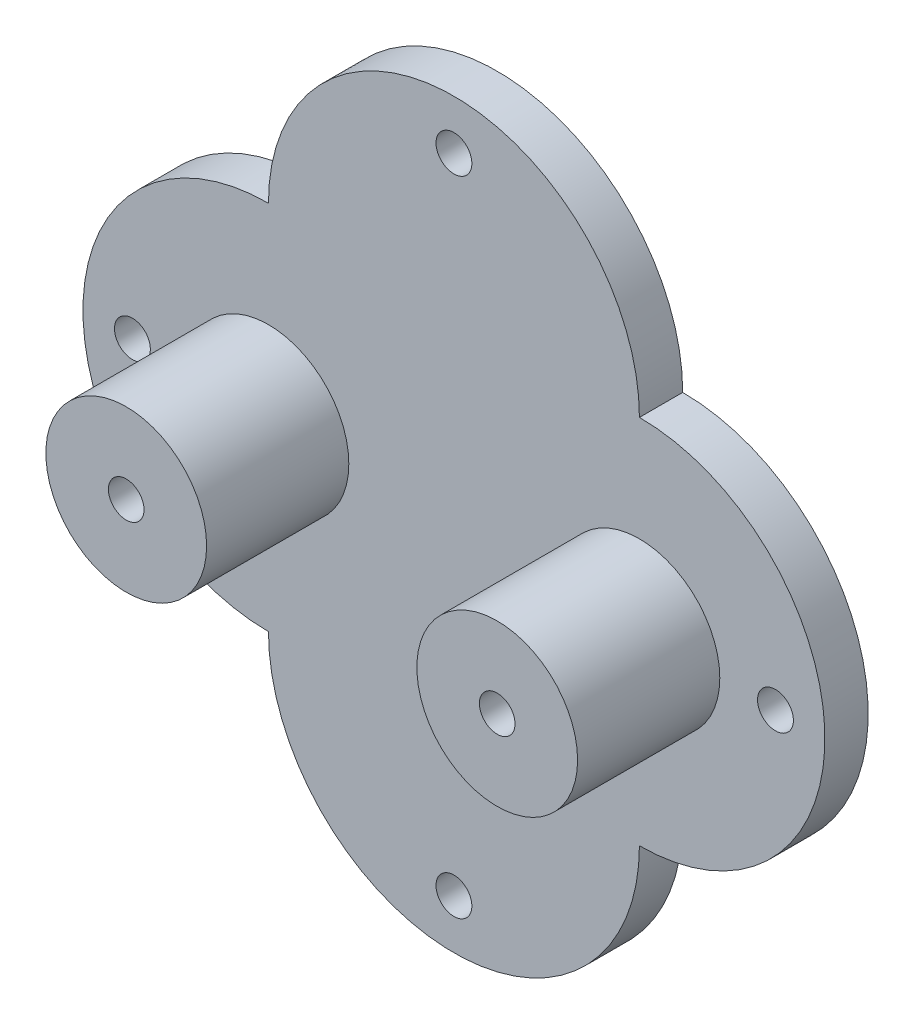
ISO-10303-21;
HEADER;
FILE_DESCRIPTION(('STEP AP214'),'2;1');
FILE_NAME('part.step','',(''),(''),'','','');
FILE_SCHEMA(('AUTOMOTIVE_DESIGN { 1 0 10303 214 1 1 1 1 }'));
ENDSEC;
DATA;
#1=APPLICATION_CONTEXT('core data for automotive mechanical design processes');
#2=APPLICATION_PROTOCOL_DEFINITION('international standard','automotive_design',2000,#1);
#3=PRODUCT_CONTEXT('',#1,'mechanical');
#4=PRODUCT('Part','Part','',(#3));
#5=PRODUCT_RELATED_PRODUCT_CATEGORY('part','',(#4));
#6=PRODUCT_DEFINITION_FORMATION('','',#4);
#7=PRODUCT_DEFINITION_CONTEXT('part definition',#1,'design');
#8=PRODUCT_DEFINITION('design','',#6,#7);
#9=PRODUCT_DEFINITION_SHAPE('','',#8);
#10=(LENGTH_UNIT() NAMED_UNIT(*) SI_UNIT(.MILLI.,.METRE.));
#11=(NAMED_UNIT(*) PLANE_ANGLE_UNIT() SI_UNIT($,.RADIAN.));
#12=(NAMED_UNIT(*) SI_UNIT($,.STERADIAN.) SOLID_ANGLE_UNIT());
#13=UNCERTAINTY_MEASURE_WITH_UNIT(LENGTH_MEASURE(1.E-05),#10,'distance_accuracy_value','');
#14=(GEOMETRIC_REPRESENTATION_CONTEXT(3) GLOBAL_UNCERTAINTY_ASSIGNED_CONTEXT((#13)) GLOBAL_UNIT_ASSIGNED_CONTEXT((#10,
#11,#12)) REPRESENTATION_CONTEXT('',''));
#15=CARTESIAN_POINT('',(0.,0.,0.));
#16=DIRECTION('',(0.,0.,1.));
#17=DIRECTION('',(1.,0.,0.));
#18=AXIS2_PLACEMENT_3D('',#15,#16,#17);
#19=CARTESIAN_POINT('',(15.,0.,2.));
#20=DIRECTION('',(0.,0.,-1.));
#21=DIRECTION('',(-1.,0.,0.));
#22=AXIS2_PLACEMENT_3D('',#19,#20,#21);
#23=CYLINDRICAL_SURFACE('',#22,15.);
#24=DIRECTION('',(0.,0.,-1.));
#25=VECTOR('',#24,1.);
#26=CARTESIAN_POINT('',(15.,-15.,2.));
#27=LINE('',#26,#25);
#28=CARTESIAN_POINT('',(15.,-15.,3.5));
#29=VERTEX_POINT('',#28);
#30=CARTESIAN_POINT('',(15.,-15.,0.));
#31=VERTEX_POINT('',#30);
#32=EDGE_CURVE('E54',#29,#31,#27,.T.);
#33=ORIENTED_EDGE('',*,*,#32,.T.);
#34=CARTESIAN_POINT('',(15.,0.,0.));
#35=DIRECTION('',(0.,0.,1.));
#36=DIRECTION('',(1.,0.,0.));
#37=AXIS2_PLACEMENT_3D('',#34,#35,#36);
#38=CIRCLE('',#37,15.);
#39=CARTESIAN_POINT('',(15.,15.,0.));
#40=VERTEX_POINT('',#39);
#41=EDGE_CURVE('E118',#31,#40,#38,.T.);
#42=ORIENTED_EDGE('',*,*,#41,.T.);
#43=DIRECTION('',(0.,0.,-1.));
#44=VECTOR('',#43,1.);
#45=CARTESIAN_POINT('',(15.,15.,2.));
#46=LINE('',#45,#44);
#47=CARTESIAN_POINT('',(15.,15.,3.5));
#48=VERTEX_POINT('',#47);
#49=EDGE_CURVE('E90',#48,#40,#46,.T.);
#50=ORIENTED_EDGE('',*,*,#49,.F.);
#51=CARTESIAN_POINT('',(15.,0.,3.5));
#52=DIRECTION('',(0.,0.,1.));
#53=DIRECTION('',(1.,0.,0.));
#54=AXIS2_PLACEMENT_3D('',#51,#52,#53);
#55=CIRCLE('',#54,15.);
#56=EDGE_CURVE('E102',#29,#48,#55,.T.);
#57=ORIENTED_EDGE('',*,*,#56,.F.);
#58=EDGE_LOOP('',(#33,#42,#50,#57));
#59=FACE_BOUND('',#58,.T.);
#60=ADVANCED_FACE('F39',(#59),#23,.T.);
#61=CARTESIAN_POINT('',(0.,15.,2.));
#62=DIRECTION('',(0.,0.,-1.));
#63=DIRECTION('',(-1.,0.,0.));
#64=AXIS2_PLACEMENT_3D('',#61,#62,#63);
#65=CYLINDRICAL_SURFACE('',#64,15.);
#66=ORIENTED_EDGE('',*,*,#49,.T.);
#67=CARTESIAN_POINT('',(0.,15.,0.));
#68=DIRECTION('',(0.,0.,1.));
#69=DIRECTION('',(1.,0.,0.));
#70=AXIS2_PLACEMENT_3D('',#67,#68,#69);
#71=CIRCLE('',#70,15.);
#72=CARTESIAN_POINT('',(-15.,15.,0.));
#73=VERTEX_POINT('',#72);
#74=EDGE_CURVE('E87',#40,#73,#71,.T.);
#75=ORIENTED_EDGE('',*,*,#74,.T.);
#76=DIRECTION('',(0.,0.,-1.));
#77=VECTOR('',#76,1.);
#78=CARTESIAN_POINT('',(-15.,15.,2.));
#79=LINE('',#78,#77);
#80=CARTESIAN_POINT('',(-15.,15.,3.5));
#81=VERTEX_POINT('',#80);
#82=EDGE_CURVE('E81',#81,#73,#79,.T.);
#83=ORIENTED_EDGE('',*,*,#82,.F.);
#84=CARTESIAN_POINT('',(0.,15.,3.5));
#85=DIRECTION('',(0.,0.,1.));
#86=DIRECTION('',(1.,0.,0.));
#87=AXIS2_PLACEMENT_3D('',#84,#85,#86);
#88=CIRCLE('',#87,15.);
#89=EDGE_CURVE('E85',#48,#81,#88,.T.);
#90=ORIENTED_EDGE('',*,*,#89,.F.);
#91=EDGE_LOOP('',(#66,#75,#83,#90));
#92=FACE_BOUND('',#91,.T.);
#93=ADVANCED_FACE('F83',(#92),#65,.T.);
#94=CARTESIAN_POINT('',(-15.,0.,2.));
#95=DIRECTION('',(0.,0.,-1.));
#96=DIRECTION('',(-1.,0.,0.));
#97=AXIS2_PLACEMENT_3D('',#94,#95,#96);
#98=CYLINDRICAL_SURFACE('',#97,15.);
#99=ORIENTED_EDGE('',*,*,#82,.T.);
#100=CARTESIAN_POINT('',(-15.,0.,0.));
#101=DIRECTION('',(0.,0.,1.));
#102=DIRECTION('',(1.,0.,0.));
#103=AXIS2_PLACEMENT_3D('',#100,#101,#102);
#104=CIRCLE('',#103,15.);
#105=CARTESIAN_POINT('',(-15.,-15.,0.));
#106=VERTEX_POINT('',#105);
#107=EDGE_CURVE('E121',#73,#106,#104,.T.);
#108=ORIENTED_EDGE('',*,*,#107,.T.);
#109=DIRECTION('',(0.,0.,-1.));
#110=VECTOR('',#109,1.);
#111=CARTESIAN_POINT('',(-15.,-15.,2.));
#112=LINE('',#111,#110);
#113=CARTESIAN_POINT('',(-15.,-15.,3.5));
#114=VERTEX_POINT('',#113);
#115=EDGE_CURVE('E61',#114,#106,#112,.T.);
#116=ORIENTED_EDGE('',*,*,#115,.F.);
#117=CARTESIAN_POINT('',(-15.,0.,3.5));
#118=DIRECTION('',(0.,0.,1.));
#119=DIRECTION('',(1.,0.,0.));
#120=AXIS2_PLACEMENT_3D('',#117,#118,#119);
#121=CIRCLE('',#120,15.);
#122=EDGE_CURVE('E93',#81,#114,#121,.T.);
#123=ORIENTED_EDGE('',*,*,#122,.F.);
#124=EDGE_LOOP('',(#99,#108,#116,#123));
#125=FACE_BOUND('',#124,.T.);
#126=ADVANCED_FACE('F94',(#125),#98,.T.);
#127=CARTESIAN_POINT('',(0.,-15.,2.));
#128=DIRECTION('',(0.,0.,-1.));
#129=DIRECTION('',(-1.,0.,0.));
#130=AXIS2_PLACEMENT_3D('',#127,#128,#129);
#131=CYLINDRICAL_SURFACE('',#130,15.);
#132=ORIENTED_EDGE('',*,*,#115,.T.);
#133=CARTESIAN_POINT('',(0.,-15.,0.));
#134=DIRECTION('',(0.,0.,1.));
#135=DIRECTION('',(1.,0.,0.));
#136=AXIS2_PLACEMENT_3D('',#133,#134,#135);
#137=CIRCLE('',#136,15.);
#138=EDGE_CURVE('E123',#106,#31,#137,.T.);
#139=ORIENTED_EDGE('',*,*,#138,.T.);
#140=ORIENTED_EDGE('',*,*,#32,.F.);
#141=CARTESIAN_POINT('',(0.,-15.,3.5));
#142=DIRECTION('',(0.,0.,1.));
#143=DIRECTION('',(1.,0.,0.));
#144=AXIS2_PLACEMENT_3D('',#141,#142,#143);
#145=CIRCLE('',#144,15.);
#146=EDGE_CURVE('E97',#114,#29,#145,.T.);
#147=ORIENTED_EDGE('',*,*,#146,.F.);
#148=EDGE_LOOP('',(#132,#139,#140,#147));
#149=FACE_BOUND('',#148,.T.);
#150=ADVANCED_FACE('F177',(#149),#131,.T.);
#151=CARTESIAN_POINT('',(0.,0.,0.));
#152=DIRECTION('',(0.,0.,1.));
#153=DIRECTION('',(1.,0.,0.));
#154=AXIS2_PLACEMENT_3D('',#151,#152,#153);
#155=PLANE('',#154);
#156=CARTESIAN_POINT('',(0.,-26.,0.));
#157=DIRECTION('',(0.,0.,1.));
#158=DIRECTION('',(1.,0.,0.));
#159=AXIS2_PLACEMENT_3D('',#156,#157,#158);
#160=CIRCLE('',#159,1.45);
#161=CARTESIAN_POINT('',(1.45,-26.,0.));
#162=VERTEX_POINT('',#161);
#163=EDGE_CURVE('E225',#162,#162,#160,.T.);
#164=ORIENTED_EDGE('',*,*,#163,.T.);
#165=EDGE_LOOP('',(#164));
#166=FACE_BOUND('',#165,.T.);
#167=CARTESIAN_POINT('',(26.,0.,0.));
#168=DIRECTION('',(0.,0.,1.));
#169=DIRECTION('',(1.,0.,0.));
#170=AXIS2_PLACEMENT_3D('',#167,#168,#169);
#171=CIRCLE('',#170,1.45);
#172=CARTESIAN_POINT('',(27.45,0.,0.));
#173=VERTEX_POINT('',#172);
#174=EDGE_CURVE('E221',#173,#173,#171,.T.);
#175=ORIENTED_EDGE('',*,*,#174,.T.);
#176=EDGE_LOOP('',(#175));
#177=FACE_BOUND('',#176,.T.);
#178=CARTESIAN_POINT('',(-26.,0.,0.));
#179=DIRECTION('',(0.,0.,1.));
#180=DIRECTION('',(1.,0.,0.));
#181=AXIS2_PLACEMENT_3D('',#178,#179,#180);
#182=CIRCLE('',#181,1.45);
#183=CARTESIAN_POINT('',(-24.55,0.,0.));
#184=VERTEX_POINT('',#183);
#185=EDGE_CURVE('E216',#184,#184,#182,.T.);
#186=ORIENTED_EDGE('',*,*,#185,.T.);
#187=EDGE_LOOP('',(#186));
#188=FACE_BOUND('',#187,.T.);
#189=CARTESIAN_POINT('',(0.,26.,0.));
#190=DIRECTION('',(0.,0.,1.));
#191=DIRECTION('',(1.,0.,0.));
#192=AXIS2_PLACEMENT_3D('',#189,#190,#191);
#193=CIRCLE('',#192,1.45);
#194=CARTESIAN_POINT('',(1.45,26.,0.));
#195=VERTEX_POINT('',#194);
#196=EDGE_CURVE('E141',#195,#195,#193,.T.);
#197=ORIENTED_EDGE('',*,*,#196,.T.);
#198=EDGE_LOOP('',(#197));
#199=FACE_BOUND('',#198,.T.);
#200=ORIENTED_EDGE('',*,*,#41,.F.);
#201=ORIENTED_EDGE('',*,*,#138,.F.);
#202=ORIENTED_EDGE('',*,*,#107,.F.);
#203=ORIENTED_EDGE('',*,*,#74,.F.);
#204=EDGE_LOOP('',(#200,#201,#202,#203));
#205=FACE_BOUND('',#204,.T.);
#206=ADVANCED_FACE('F182',(#166,#177,#188,#199,#205),#155,.F.);
#207=CARTESIAN_POINT('',(0.,0.,3.5));
#208=DIRECTION('',(0.,0.,1.));
#209=DIRECTION('',(1.,0.,0.));
#210=AXIS2_PLACEMENT_3D('',#207,#208,#209);
#211=PLANE('',#210);
#212=CARTESIAN_POINT('',(0.,-26.,3.5));
#213=DIRECTION('',(0.,0.,1.));
#214=DIRECTION('',(1.,0.,0.));
#215=AXIS2_PLACEMENT_3D('',#212,#213,#214);
#216=CIRCLE('',#215,1.45);
#217=CARTESIAN_POINT('',(1.45,-26.,3.5));
#218=VERTEX_POINT('',#217);
#219=EDGE_CURVE('E204',#218,#218,#216,.T.);
#220=ORIENTED_EDGE('',*,*,#219,.F.);
#221=EDGE_LOOP('',(#220));
#222=FACE_BOUND('',#221,.T.);
#223=CARTESIAN_POINT('',(26.,0.,3.5));
#224=DIRECTION('',(0.,0.,1.));
#225=DIRECTION('',(1.,0.,0.));
#226=AXIS2_PLACEMENT_3D('',#223,#224,#225);
#227=CIRCLE('',#226,1.45);
#228=CARTESIAN_POINT('',(27.45,0.,3.5));
#229=VERTEX_POINT('',#228);
#230=EDGE_CURVE('E208',#229,#229,#227,.T.);
#231=ORIENTED_EDGE('',*,*,#230,.F.);
#232=EDGE_LOOP('',(#231));
#233=FACE_BOUND('',#232,.T.);
#234=CARTESIAN_POINT('',(-26.,0.,3.5));
#235=DIRECTION('',(0.,0.,1.));
#236=DIRECTION('',(1.,0.,0.));
#237=AXIS2_PLACEMENT_3D('',#234,#235,#236);
#238=CIRCLE('',#237,1.45);
#239=CARTESIAN_POINT('',(-24.55,0.,3.5));
#240=VERTEX_POINT('',#239);
#241=EDGE_CURVE('E212',#240,#240,#238,.T.);
#242=ORIENTED_EDGE('',*,*,#241,.F.);
#243=EDGE_LOOP('',(#242));
#244=FACE_BOUND('',#243,.T.);
#245=CARTESIAN_POINT('',(0.,26.,3.5));
#246=DIRECTION('',(0.,0.,1.));
#247=DIRECTION('',(1.,0.,0.));
#248=AXIS2_PLACEMENT_3D('',#245,#246,#247);
#249=CIRCLE('',#248,1.45);
#250=CARTESIAN_POINT('',(1.45,26.,3.5));
#251=VERTEX_POINT('',#250);
#252=EDGE_CURVE('E146',#251,#251,#249,.T.);
#253=ORIENTED_EDGE('',*,*,#252,.F.);
#254=EDGE_LOOP('',(#253));
#255=FACE_BOUND('',#254,.T.);
#256=ORIENTED_EDGE('',*,*,#89,.T.);
#257=ORIENTED_EDGE('',*,*,#122,.T.);
#258=ORIENTED_EDGE('',*,*,#146,.T.);
#259=ORIENTED_EDGE('',*,*,#56,.T.);
#260=EDGE_LOOP('',(#256,#257,#258,#259));
#261=FACE_BOUND('',#260,.T.);
#262=CARTESIAN_POINT('',(-15.,0.,3.5));
#263=DIRECTION('',(0.,0.,1.));
#264=DIRECTION('',(1.,0.,0.));
#265=AXIS2_PLACEMENT_3D('',#262,#263,#264);
#266=CIRCLE('',#265,6.5);
#267=CARTESIAN_POINT('',(-8.5,0.,3.5));
#268=VERTEX_POINT('',#267);
#269=EDGE_CURVE('E112',#268,#268,#266,.T.);
#270=ORIENTED_EDGE('',*,*,#269,.F.);
#271=EDGE_LOOP('',(#270));
#272=FACE_BOUND('',#271,.T.);
#273=CARTESIAN_POINT('',(15.,0.,3.5));
#274=DIRECTION('',(0.,0.,1.));
#275=DIRECTION('',(1.,0.,0.));
#276=AXIS2_PLACEMENT_3D('',#273,#274,#275);
#277=CIRCLE('',#276,6.5);
#278=CARTESIAN_POINT('',(21.5,0.,3.5));
#279=VERTEX_POINT('',#278);
#280=EDGE_CURVE('E114',#279,#279,#277,.T.);
#281=ORIENTED_EDGE('',*,*,#280,.F.);
#282=EDGE_LOOP('',(#281));
#283=FACE_BOUND('',#282,.T.);
#284=ADVANCED_FACE('F100',(#222,#233,#244,#255,#261,#272,#283),#211,.T.);
#285=CARTESIAN_POINT('',(15.,0.,11.7));
#286=DIRECTION('',(0.,0.,-1.));
#287=DIRECTION('',(-1.,0.,0.));
#288=AXIS2_PLACEMENT_3D('',#285,#286,#287);
#289=CYLINDRICAL_SURFACE('',#288,6.5);
#290=ORIENTED_EDGE('',*,*,#280,.T.);
#291=EDGE_LOOP('',(#290));
#292=FACE_BOUND('',#291,.T.);
#293=CARTESIAN_POINT('',(15.,0.,15.));
#294=DIRECTION('',(0.,0.,1.));
#295=DIRECTION('',(1.,0.,0.));
#296=AXIS2_PLACEMENT_3D('',#293,#294,#295);
#297=CIRCLE('',#296,6.5);
#298=CARTESIAN_POINT('',(21.5,0.,15.));
#299=VERTEX_POINT('',#298);
#300=EDGE_CURVE('E103',#299,#299,#297,.T.);
#301=ORIENTED_EDGE('',*,*,#300,.F.);
#302=EDGE_LOOP('',(#301));
#303=FACE_BOUND('',#302,.T.);
#304=ADVANCED_FACE('F166',(#292,#303),#289,.T.);
#305=CARTESIAN_POINT('',(-15.,0.,11.7));
#306=DIRECTION('',(0.,0.,-1.));
#307=DIRECTION('',(-1.,0.,0.));
#308=AXIS2_PLACEMENT_3D('',#305,#306,#307);
#309=CYLINDRICAL_SURFACE('',#308,6.5);
#310=ORIENTED_EDGE('',*,*,#269,.T.);
#311=EDGE_LOOP('',(#310));
#312=FACE_BOUND('',#311,.T.);
#313=CARTESIAN_POINT('',(-15.,0.,15.));
#314=DIRECTION('',(0.,0.,1.));
#315=DIRECTION('',(1.,0.,0.));
#316=AXIS2_PLACEMENT_3D('',#313,#314,#315);
#317=CIRCLE('',#316,6.5);
#318=CARTESIAN_POINT('',(-8.5,0.,15.));
#319=VERTEX_POINT('',#318);
#320=EDGE_CURVE('E140',#319,#319,#317,.T.);
#321=ORIENTED_EDGE('',*,*,#320,.F.);
#322=EDGE_LOOP('',(#321));
#323=FACE_BOUND('',#322,.T.);
#324=ADVANCED_FACE('F157',(#312,#323),#309,.T.);
#325=CARTESIAN_POINT('',(15.,0.,15.));
#326=DIRECTION('',(0.,0.,1.));
#327=DIRECTION('',(1.,0.,0.));
#328=AXIS2_PLACEMENT_3D('',#325,#326,#327);
#329=PLANE('',#328);
#330=ORIENTED_EDGE('',*,*,#300,.T.);
#331=EDGE_LOOP('',(#330));
#332=FACE_BOUND('',#331,.T.);
#333=CARTESIAN_POINT('',(15.,0.,15.));
#334=DIRECTION('',(0.,0.,1.));
#335=DIRECTION('',(1.,0.,0.));
#336=AXIS2_PLACEMENT_3D('',#333,#334,#335);
#337=CIRCLE('',#336,1.44);
#338=CARTESIAN_POINT('',(16.44,0.,15.));
#339=VERTEX_POINT('',#338);
#340=EDGE_CURVE('E106',#339,#339,#337,.T.);
#341=ORIENTED_EDGE('',*,*,#340,.F.);
#342=EDGE_LOOP('',(#341));
#343=FACE_BOUND('',#342,.T.);
#344=ADVANCED_FACE('F154',(#332,#343),#329,.T.);
#345=CARTESIAN_POINT('',(15.,0.,3.5));
#346=DIRECTION('',(0.,0.,1.));
#347=DIRECTION('',(1.,0.,0.));
#348=AXIS2_PLACEMENT_3D('',#345,#346,#347);
#349=CIRCLE('',#348,1.44);
#350=CARTESIAN_POINT('',(16.44,0.,3.5));
#351=VERTEX_POINT('',#350);
#352=EDGE_CURVE('E11',#351,#351,#349,.T.);
#353=ORIENTED_EDGE('',*,*,#352,.T.);
#354=EDGE_LOOP('',(#353));
#355=FACE_BOUND('',#354,.T.);
#356=ADVANCED_FACE('F156',(#355),#211,.T.);
#357=CARTESIAN_POINT('',(15.,0.,11.7));
#358=DIRECTION('',(0.,0.,-1.));
#359=DIRECTION('',(-1.,0.,0.));
#360=AXIS2_PLACEMENT_3D('',#357,#358,#359);
#361=CYLINDRICAL_SURFACE('',#360,1.44);
#362=ORIENTED_EDGE('',*,*,#352,.F.);
#363=EDGE_LOOP('',(#362));
#364=FACE_BOUND('',#363,.T.);
#365=ORIENTED_EDGE('',*,*,#340,.T.);
#366=EDGE_LOOP('',(#365));
#367=FACE_BOUND('',#366,.T.);
#368=ADVANCED_FACE('F152',(#364,#367),#361,.F.);
#369=CARTESIAN_POINT('',(-15.,0.,15.));
#370=DIRECTION('',(0.,0.,1.));
#371=DIRECTION('',(1.,0.,0.));
#372=AXIS2_PLACEMENT_3D('',#369,#370,#371);
#373=PLANE('',#372);
#374=ORIENTED_EDGE('',*,*,#320,.T.);
#375=EDGE_LOOP('',(#374));
#376=FACE_BOUND('',#375,.T.);
#377=CARTESIAN_POINT('',(-15.,0.,15.));
#378=DIRECTION('',(0.,0.,1.));
#379=DIRECTION('',(1.,0.,0.));
#380=AXIS2_PLACEMENT_3D('',#377,#378,#379);
#381=CIRCLE('',#380,1.44);
#382=CARTESIAN_POINT('',(-13.56,0.,15.));
#383=VERTEX_POINT('',#382);
#384=EDGE_CURVE('E138',#383,#383,#381,.T.);
#385=ORIENTED_EDGE('',*,*,#384,.F.);
#386=EDGE_LOOP('',(#385));
#387=FACE_BOUND('',#386,.T.);
#388=ADVANCED_FACE('F190',(#376,#387),#373,.T.);
#389=CARTESIAN_POINT('',(-15.,0.,3.5));
#390=DIRECTION('',(0.,0.,1.));
#391=DIRECTION('',(1.,0.,0.));
#392=AXIS2_PLACEMENT_3D('',#389,#390,#391);
#393=CIRCLE('',#392,1.44);
#394=CARTESIAN_POINT('',(-13.56,0.,3.5));
#395=VERTEX_POINT('',#394);
#396=EDGE_CURVE('E42',#395,#395,#393,.T.);
#397=ORIENTED_EDGE('',*,*,#396,.T.);
#398=EDGE_LOOP('',(#397));
#399=FACE_BOUND('',#398,.T.);
#400=ADVANCED_FACE('F129',(#399),#211,.T.);
#401=CARTESIAN_POINT('',(-15.,0.,11.7));
#402=DIRECTION('',(0.,0.,-1.));
#403=DIRECTION('',(-1.,0.,0.));
#404=AXIS2_PLACEMENT_3D('',#401,#402,#403);
#405=CYLINDRICAL_SURFACE('',#404,1.44);
#406=ORIENTED_EDGE('',*,*,#396,.F.);
#407=EDGE_LOOP('',(#406));
#408=FACE_BOUND('',#407,.T.);
#409=ORIENTED_EDGE('',*,*,#384,.T.);
#410=EDGE_LOOP('',(#409));
#411=FACE_BOUND('',#410,.T.);
#412=ADVANCED_FACE('F131',(#408,#411),#405,.F.);
#413=CARTESIAN_POINT('',(0.,26.,0.));
#414=DIRECTION('',(0.,0.,1.));
#415=DIRECTION('',(1.,0.,0.));
#416=AXIS2_PLACEMENT_3D('',#413,#414,#415);
#417=CYLINDRICAL_SURFACE('',#416,1.45);
#418=ORIENTED_EDGE('',*,*,#196,.F.);
#419=EDGE_LOOP('',(#418));
#420=FACE_BOUND('',#419,.T.);
#421=ORIENTED_EDGE('',*,*,#252,.T.);
#422=EDGE_LOOP('',(#421));
#423=FACE_BOUND('',#422,.T.);
#424=ADVANCED_FACE('F134',(#420,#423),#417,.F.);
#425=CARTESIAN_POINT('',(-26.,0.,0.));
#426=DIRECTION('',(0.,0.,1.));
#427=DIRECTION('',(1.,0.,0.));
#428=AXIS2_PLACEMENT_3D('',#425,#426,#427);
#429=CYLINDRICAL_SURFACE('',#428,1.45);
#430=ORIENTED_EDGE('',*,*,#185,.F.);
#431=EDGE_LOOP('',(#430));
#432=FACE_BOUND('',#431,.T.);
#433=ORIENTED_EDGE('',*,*,#241,.T.);
#434=EDGE_LOOP('',(#433));
#435=FACE_BOUND('',#434,.T.);
#436=ADVANCED_FACE('F241',(#432,#435),#429,.F.);
#437=CARTESIAN_POINT('',(26.,0.,0.));
#438=DIRECTION('',(0.,0.,1.));
#439=DIRECTION('',(1.,0.,0.));
#440=AXIS2_PLACEMENT_3D('',#437,#438,#439);
#441=CYLINDRICAL_SURFACE('',#440,1.45);
#442=ORIENTED_EDGE('',*,*,#174,.F.);
#443=EDGE_LOOP('',(#442));
#444=FACE_BOUND('',#443,.T.);
#445=ORIENTED_EDGE('',*,*,#230,.T.);
#446=EDGE_LOOP('',(#445));
#447=FACE_BOUND('',#446,.T.);
#448=ADVANCED_FACE('F236',(#444,#447),#441,.F.);
#449=CARTESIAN_POINT('',(0.,-26.,0.));
#450=DIRECTION('',(0.,0.,1.));
#451=DIRECTION('',(1.,0.,0.));
#452=AXIS2_PLACEMENT_3D('',#449,#450,#451);
#453=CYLINDRICAL_SURFACE('',#452,1.45);
#454=ORIENTED_EDGE('',*,*,#163,.F.);
#455=EDGE_LOOP('',(#454));
#456=FACE_BOUND('',#455,.T.);
#457=ORIENTED_EDGE('',*,*,#219,.T.);
#458=EDGE_LOOP('',(#457));
#459=FACE_BOUND('',#458,.T.);
#460=ADVANCED_FACE('F233',(#456,#459),#453,.F.);
#461=CLOSED_SHELL('',(#60,#93,#126,#150,#206,#284,#304,#324,#344,#356,#368,#388,#400,#412,#424,
#436,#448,#460));
#462=MANIFOLD_SOLID_BREP('B2',#461);
#463=ADVANCED_BREP_SHAPE_REPRESENTATION('',(#18,#462),#14);
#464=SHAPE_DEFINITION_REPRESENTATION(#9,#463);
ENDSEC;
END-ISO-10303-21;
